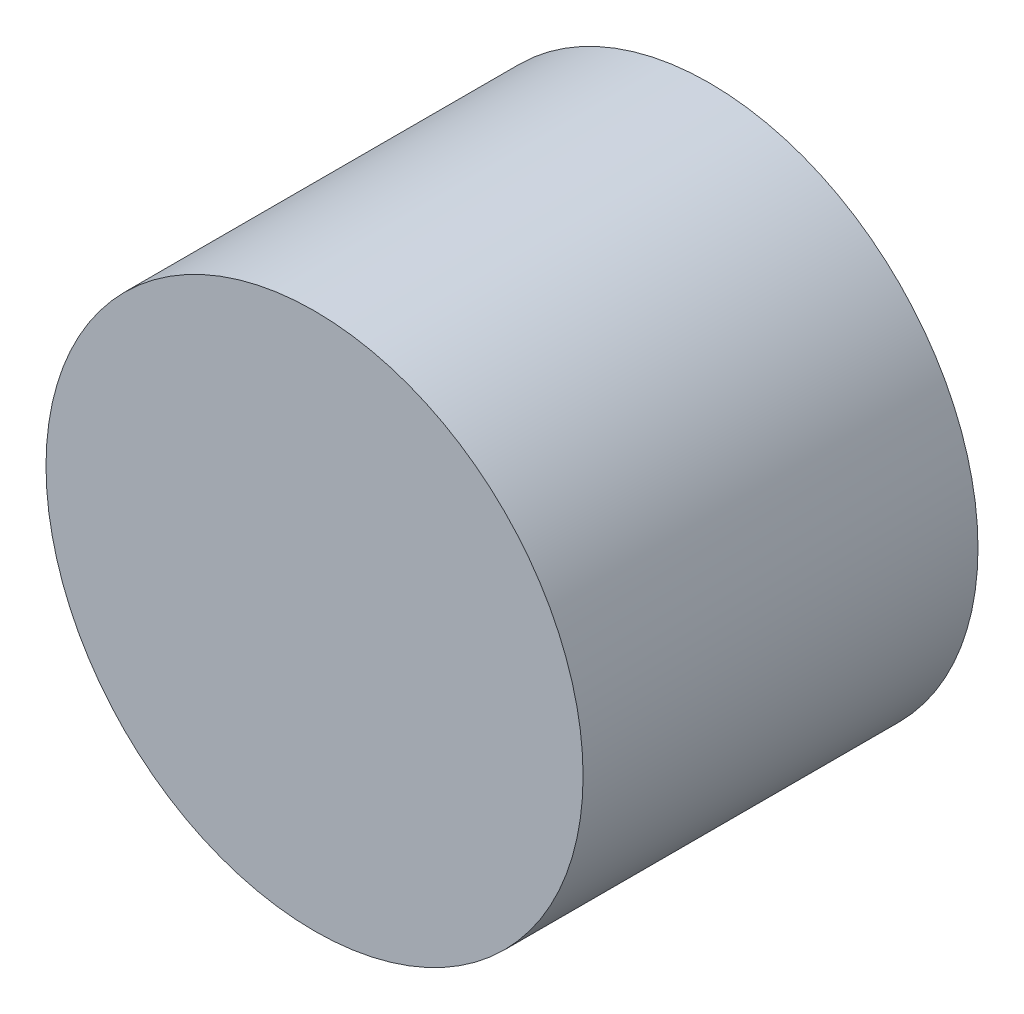
ISO-10303-21;
HEADER;
FILE_DESCRIPTION(('STEP AP214'),'2;1');
FILE_NAME('part.step','',(''),(''),'','','');
FILE_SCHEMA(('AUTOMOTIVE_DESIGN { 1 0 10303 214 1 1 1 1 }'));
ENDSEC;
DATA;
#1=APPLICATION_CONTEXT('core data for automotive mechanical design processes');
#2=APPLICATION_PROTOCOL_DEFINITION('international standard','automotive_design',2000,#1);
#3=PRODUCT_CONTEXT('',#1,'mechanical');
#4=PRODUCT('Part','Part','',(#3));
#5=PRODUCT_RELATED_PRODUCT_CATEGORY('part','',(#4));
#6=PRODUCT_DEFINITION_FORMATION('','',#4);
#7=PRODUCT_DEFINITION_CONTEXT('part definition',#1,'design');
#8=PRODUCT_DEFINITION('design','',#6,#7);
#9=PRODUCT_DEFINITION_SHAPE('','',#8);
#10=(LENGTH_UNIT() NAMED_UNIT(*) SI_UNIT(.MILLI.,.METRE.));
#11=(NAMED_UNIT(*) PLANE_ANGLE_UNIT() SI_UNIT($,.RADIAN.));
#12=(NAMED_UNIT(*) SI_UNIT($,.STERADIAN.) SOLID_ANGLE_UNIT());
#13=UNCERTAINTY_MEASURE_WITH_UNIT(LENGTH_MEASURE(1.E-05),#10,'distance_accuracy_value','');
#14=(GEOMETRIC_REPRESENTATION_CONTEXT(3) GLOBAL_UNCERTAINTY_ASSIGNED_CONTEXT((#13)) GLOBAL_UNIT_ASSIGNED_CONTEXT((#10,
#11,#12)) REPRESENTATION_CONTEXT('',''));
#15=CARTESIAN_POINT('',(0.,0.,0.));
#16=DIRECTION('',(0.,0.,1.));
#17=DIRECTION('',(1.,0.,0.));
#18=AXIS2_PLACEMENT_3D('',#15,#16,#17);
#19=CARTESIAN_POINT('',(0.,0.,25.));
#20=DIRECTION('',(0.,0.,-1.));
#21=DIRECTION('',(-1.,0.,0.));
#22=AXIS2_PLACEMENT_3D('',#19,#20,#21);
#23=CYLINDRICAL_SURFACE('',#22,17.);
#24=CARTESIAN_POINT('',(0.,0.,25.));
#25=DIRECTION('',(0.,0.,1.));
#26=DIRECTION('',(1.,0.,0.));
#27=AXIS2_PLACEMENT_3D('',#24,#25,#26);
#28=CIRCLE('',#27,17.);
#29=CARTESIAN_POINT('',(17.,0.,25.));
#30=VERTEX_POINT('',#29);
#31=EDGE_CURVE('E11',#30,#30,#28,.T.);
#32=ORIENTED_EDGE('',*,*,#31,.F.);
#33=EDGE_LOOP('',(#32));
#34=FACE_BOUND('',#33,.T.);
#35=CARTESIAN_POINT('',(0.,0.,0.));
#36=DIRECTION('',(0.,0.,1.));
#37=DIRECTION('',(1.,0.,0.));
#38=AXIS2_PLACEMENT_3D('',#35,#36,#37);
#39=CIRCLE('',#38,17.);
#40=CARTESIAN_POINT('',(17.,0.,0.));
#41=VERTEX_POINT('',#40);
#42=EDGE_CURVE('E54',#41,#41,#39,.T.);
#43=ORIENTED_EDGE('',*,*,#42,.T.);
#44=EDGE_LOOP('',(#43));
#45=FACE_BOUND('',#44,.T.);
#46=ADVANCED_FACE('F51',(#34,#45),#23,.T.);
#47=CARTESIAN_POINT('',(0.,0.,25.));
#48=DIRECTION('',(0.,0.,1.));
#49=DIRECTION('',(1.,0.,0.));
#50=AXIS2_PLACEMENT_3D('',#47,#48,#49);
#51=PLANE('',#50);
#52=ORIENTED_EDGE('',*,*,#31,.T.);
#53=EDGE_LOOP('',(#52));
#54=FACE_BOUND('',#53,.T.);
#55=ADVANCED_FACE('F84',(#54),#51,.T.);
#56=CARTESIAN_POINT('',(0.,0.,0.));
#57=DIRECTION('',(0.,0.,1.));
#58=DIRECTION('',(1.,0.,0.));
#59=AXIS2_PLACEMENT_3D('',#56,#57,#58);
#60=PLANE('',#59);
#61=CARTESIAN_POINT('',(0.,0.,0.));
#62=DIRECTION('',(0.,0.,-1.));
#63=DIRECTION('',(-1.,0.,0.));
#64=AXIS2_PLACEMENT_3D('',#61,#62,#63);
#65=CIRCLE('',#64,2.09999999999999);
#66=CARTESIAN_POINT('',(-2.09999999999999,0.,0.));
#67=VERTEX_POINT('',#66);
#68=EDGE_CURVE('E72',#67,#67,#65,.T.);
#69=ORIENTED_EDGE('',*,*,#68,.F.);
#70=EDGE_LOOP('',(#69));
#71=FACE_BOUND('',#70,.T.);
#72=ORIENTED_EDGE('',*,*,#42,.F.);
#73=EDGE_LOOP('',(#72));
#74=FACE_BOUND('',#73,.T.);
#75=ADVANCED_FACE('F65',(#71,#74),#60,.F.);
#76=CARTESIAN_POINT('',(0.,0.,4.));
#77=DIRECTION('',(0.,0.,-1.));
#78=DIRECTION('',(-1.,0.,0.));
#79=AXIS2_PLACEMENT_3D('',#76,#77,#78);
#80=CONICAL_SURFACE('',#79,2.1,1.02974425867665);
#81=CARTESIAN_POINT('',(0.,0.,5.26180729995788));
#82=VERTEX_POINT('',#81);
#83=VERTEX_LOOP('',#82);
#84=FACE_BOUND('',#83,.T.);
#85=CARTESIAN_POINT('',(0.,0.,4.));
#86=DIRECTION('',(0.,0.,-1.));
#87=DIRECTION('',(-1.,0.,0.));
#88=AXIS2_PLACEMENT_3D('',#85,#86,#87);
#89=CIRCLE('',#88,2.1);
#90=CARTESIAN_POINT('',(-2.1,0.,4.));
#91=VERTEX_POINT('',#90);
#92=EDGE_CURVE('E69',#91,#91,#89,.T.);
#93=ORIENTED_EDGE('',*,*,#92,.T.);
#94=EDGE_LOOP('',(#93));
#95=FACE_BOUND('',#94,.T.);
#96=ADVANCED_FACE('F61',(#84,#95),#80,.F.);
#97=CARTESIAN_POINT('',(0.,0.,0.));
#98=DIRECTION('',(0.,0.,-1.));
#99=DIRECTION('',(-1.,0.,0.));
#100=AXIS2_PLACEMENT_3D('',#97,#98,#99);
#101=CYLINDRICAL_SURFACE('',#100,2.09999999999999);
#102=ORIENTED_EDGE('',*,*,#92,.F.);
#103=EDGE_LOOP('',(#102));
#104=FACE_BOUND('',#103,.T.);
#105=ORIENTED_EDGE('',*,*,#68,.T.);
#106=EDGE_LOOP('',(#105));
#107=FACE_BOUND('',#106,.T.);
#108=ADVANCED_FACE('F64',(#104,#107),#101,.F.);
#109=CLOSED_SHELL('',(#46,#55,#75,#96,#108));
#110=MANIFOLD_SOLID_BREP('B2',#109);
#111=ADVANCED_BREP_SHAPE_REPRESENTATION('',(#18,#110),#14);
#112=SHAPE_DEFINITION_REPRESENTATION(#9,#111);
ENDSEC;
END-ISO-10303-21;
